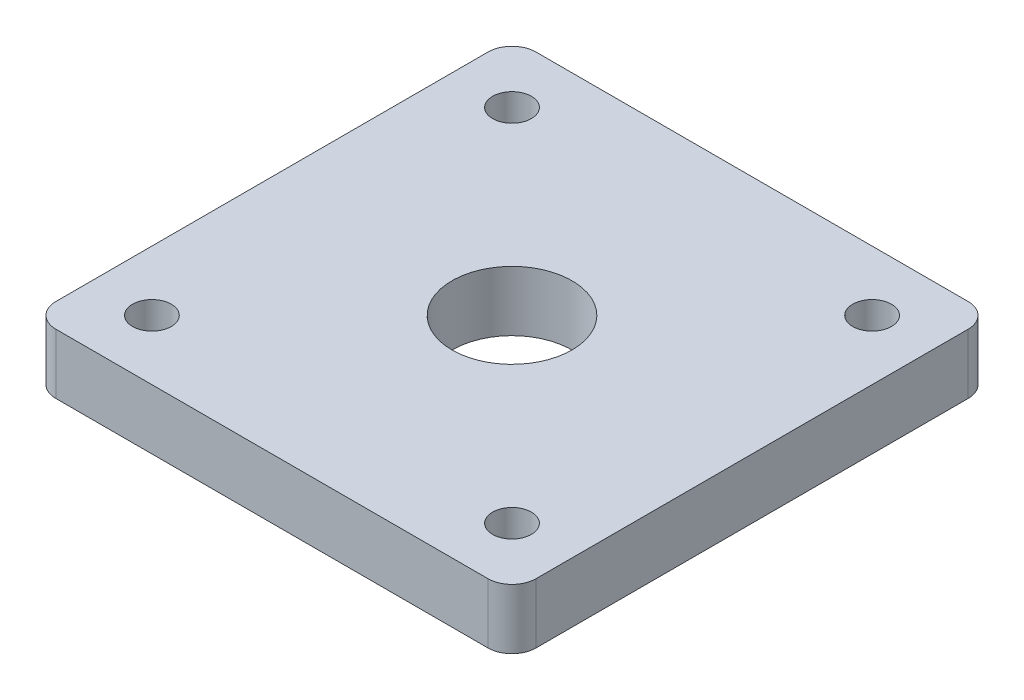
ISO-10303-21;
HEADER;
FILE_DESCRIPTION(('STEP AP214'),'2;1');
FILE_NAME('part.step','',(''),(''),'','','');
FILE_SCHEMA(('AUTOMOTIVE_DESIGN { 1 0 10303 214 1 1 1 1 }'));
ENDSEC;
DATA;
#1=APPLICATION_CONTEXT('core data for automotive mechanical design processes');
#2=APPLICATION_PROTOCOL_DEFINITION('international standard','automotive_design',2000,#1);
#3=PRODUCT_CONTEXT('',#1,'mechanical');
#4=PRODUCT('Part','Part','',(#3));
#5=PRODUCT_RELATED_PRODUCT_CATEGORY('part','',(#4));
#6=PRODUCT_DEFINITION_FORMATION('','',#4);
#7=PRODUCT_DEFINITION_CONTEXT('part definition',#1,'design');
#8=PRODUCT_DEFINITION('design','',#6,#7);
#9=PRODUCT_DEFINITION_SHAPE('','',#8);
#10=(LENGTH_UNIT() NAMED_UNIT(*) SI_UNIT(.MILLI.,.METRE.));
#11=(NAMED_UNIT(*) PLANE_ANGLE_UNIT() SI_UNIT($,.RADIAN.));
#12=(NAMED_UNIT(*) SI_UNIT($,.STERADIAN.) SOLID_ANGLE_UNIT());
#13=UNCERTAINTY_MEASURE_WITH_UNIT(LENGTH_MEASURE(1.E-05),#10,'distance_accuracy_value','');
#14=(GEOMETRIC_REPRESENTATION_CONTEXT(3) GLOBAL_UNCERTAINTY_ASSIGNED_CONTEXT((#13)) GLOBAL_UNIT_ASSIGNED_CONTEXT((#10,
#11,#12)) REPRESENTATION_CONTEXT('',''));
#15=CARTESIAN_POINT('',(0.,0.,0.));
#16=DIRECTION('',(0.,0.,1.));
#17=DIRECTION('',(1.,0.,0.));
#18=AXIS2_PLACEMENT_3D('',#15,#16,#17);
#19=CARTESIAN_POINT('',(-22.86,6.35,-22.86));
#20=DIRECTION('',(0.,-1.,0.));
#21=DIRECTION('',(0.,0.,-1.));
#22=AXIS2_PLACEMENT_3D('',#19,#20,#21);
#23=CYLINDRICAL_SURFACE('',#22,2.54);
#24=CARTESIAN_POINT('',(-22.86,0.,-22.86));
#25=DIRECTION('',(0.,1.,0.));
#26=DIRECTION('',(0.,0.,1.));
#27=AXIS2_PLACEMENT_3D('',#24,#25,#26);
#28=CIRCLE('',#27,2.54);
#29=CARTESIAN_POINT('',(-25.4,0.,-22.86));
#30=VERTEX_POINT('',#29);
#31=CARTESIAN_POINT('',(-22.86,0.,-25.4));
#32=VERTEX_POINT('',#31);
#33=EDGE_CURVE('E164',#30,#32,#28,.F.);
#34=ORIENTED_EDGE('',*,*,#33,.F.);
#35=DIRECTION('',(0.,-1.,0.));
#36=VECTOR('',#35,1.);
#37=CARTESIAN_POINT('',(-25.4,6.35,-22.86));
#38=LINE('',#37,#36);
#39=CARTESIAN_POINT('',(-25.4,6.35,-22.86));
#40=VERTEX_POINT('',#39);
#41=EDGE_CURVE('E11',#40,#30,#38,.T.);
#42=ORIENTED_EDGE('',*,*,#41,.F.);
#43=CARTESIAN_POINT('',(-22.86,6.35,-22.86));
#44=DIRECTION('',(0.,1.,0.));
#45=DIRECTION('',(0.,0.,1.));
#46=AXIS2_PLACEMENT_3D('',#43,#44,#45);
#47=CIRCLE('',#46,2.54);
#48=CARTESIAN_POINT('',(-22.86,6.35,-25.4));
#49=VERTEX_POINT('',#48);
#50=EDGE_CURVE('E210',#40,#49,#47,.F.);
#51=ORIENTED_EDGE('',*,*,#50,.T.);
#52=DIRECTION('',(0.,-1.,0.));
#53=VECTOR('',#52,1.);
#54=CARTESIAN_POINT('',(-22.86,6.35,-25.4));
#55=LINE('',#54,#53);
#56=EDGE_CURVE('E62',#49,#32,#55,.T.);
#57=ORIENTED_EDGE('',*,*,#56,.T.);
#58=EDGE_LOOP('',(#34,#42,#51,#57));
#59=FACE_BOUND('',#58,.T.);
#60=ADVANCED_FACE('F45',(#59),#23,.T.);
#61=CARTESIAN_POINT('',(-25.4,6.35,0.));
#62=DIRECTION('',(-1.,0.,0.));
#63=DIRECTION('',(0.,0.,1.));
#64=AXIS2_PLACEMENT_3D('',#61,#62,#63);
#65=PLANE('',#64);
#66=DIRECTION('',(0.,0.,-1.));
#67=VECTOR('',#66,1.);
#68=CARTESIAN_POINT('',(-25.4,0.,0.));
#69=LINE('',#68,#67);
#70=CARTESIAN_POINT('',(-25.4,0.,22.86));
#71=VERTEX_POINT('',#70);
#72=EDGE_CURVE('E167',#71,#30,#69,.T.);
#73=ORIENTED_EDGE('',*,*,#72,.F.);
#74=DIRECTION('',(0.,-1.,0.));
#75=VECTOR('',#74,1.);
#76=CARTESIAN_POINT('',(-25.4,6.35,22.86));
#77=LINE('',#76,#75);
#78=CARTESIAN_POINT('',(-25.4,6.35,22.86));
#79=VERTEX_POINT('',#78);
#80=EDGE_CURVE('E54',#79,#71,#77,.T.);
#81=ORIENTED_EDGE('',*,*,#80,.F.);
#82=DIRECTION('',(0.,0.,-1.));
#83=VECTOR('',#82,1.);
#84=CARTESIAN_POINT('',(-25.4,6.35,0.));
#85=LINE('',#84,#83);
#86=EDGE_CURVE('E253',#79,#40,#85,.T.);
#87=ORIENTED_EDGE('',*,*,#86,.T.);
#88=ORIENTED_EDGE('',*,*,#41,.T.);
#89=EDGE_LOOP('',(#73,#81,#87,#88));
#90=FACE_BOUND('',#89,.T.);
#91=ADVANCED_FACE('F234',(#90),#65,.T.);
#92=CARTESIAN_POINT('',(-22.86,6.35,22.86));
#93=DIRECTION('',(0.,-1.,0.));
#94=DIRECTION('',(0.,0.,-1.));
#95=AXIS2_PLACEMENT_3D('',#92,#93,#94);
#96=CYLINDRICAL_SURFACE('',#95,2.54);
#97=CARTESIAN_POINT('',(-22.86,0.,22.86));
#98=DIRECTION('',(0.,1.,0.));
#99=DIRECTION('',(0.,0.,1.));
#100=AXIS2_PLACEMENT_3D('',#97,#98,#99);
#101=CIRCLE('',#100,2.54);
#102=CARTESIAN_POINT('',(-22.86,0.,25.4));
#103=VERTEX_POINT('',#102);
#104=EDGE_CURVE('E171',#103,#71,#101,.F.);
#105=ORIENTED_EDGE('',*,*,#104,.F.);
#106=DIRECTION('',(0.,-1.,0.));
#107=VECTOR('',#106,1.);
#108=CARTESIAN_POINT('',(-22.86,6.35,25.4));
#109=LINE('',#108,#107);
#110=CARTESIAN_POINT('',(-22.86,6.35,25.4));
#111=VERTEX_POINT('',#110);
#112=EDGE_CURVE('E221',#111,#103,#109,.T.);
#113=ORIENTED_EDGE('',*,*,#112,.F.);
#114=CARTESIAN_POINT('',(-22.86,6.35,22.86));
#115=DIRECTION('',(0.,1.,0.));
#116=DIRECTION('',(0.,0.,1.));
#117=AXIS2_PLACEMENT_3D('',#114,#115,#116);
#118=CIRCLE('',#117,2.54);
#119=EDGE_CURVE('E230',#111,#79,#118,.F.);
#120=ORIENTED_EDGE('',*,*,#119,.T.);
#121=ORIENTED_EDGE('',*,*,#80,.T.);
#122=EDGE_LOOP('',(#105,#113,#120,#121));
#123=FACE_BOUND('',#122,.T.);
#124=ADVANCED_FACE('F228',(#123),#96,.T.);
#125=CARTESIAN_POINT('',(0.,6.35,25.4));
#126=DIRECTION('',(0.,0.,-1.));
#127=DIRECTION('',(-1.,0.,0.));
#128=AXIS2_PLACEMENT_3D('',#125,#126,#127);
#129=PLANE('',#128);
#130=DIRECTION('',(1.,0.,0.));
#131=VECTOR('',#130,1.);
#132=CARTESIAN_POINT('',(0.,0.,25.4));
#133=LINE('',#132,#131);
#134=CARTESIAN_POINT('',(22.86,0.,25.4));
#135=VERTEX_POINT('',#134);
#136=EDGE_CURVE('E175',#103,#135,#133,.T.);
#137=ORIENTED_EDGE('',*,*,#136,.T.);
#138=DIRECTION('',(0.,-1.,0.));
#139=VECTOR('',#138,1.);
#140=CARTESIAN_POINT('',(22.86,6.35,25.4));
#141=LINE('',#140,#139);
#142=CARTESIAN_POINT('',(22.86,6.35,25.4));
#143=VERTEX_POINT('',#142);
#144=EDGE_CURVE('E217',#143,#135,#141,.T.);
#145=ORIENTED_EDGE('',*,*,#144,.F.);
#146=DIRECTION('',(1.,0.,0.));
#147=VECTOR('',#146,1.);
#148=CARTESIAN_POINT('',(0.,6.35,25.4));
#149=LINE('',#148,#147);
#150=EDGE_CURVE('E247',#111,#143,#149,.T.);
#151=ORIENTED_EDGE('',*,*,#150,.F.);
#152=ORIENTED_EDGE('',*,*,#112,.T.);
#153=EDGE_LOOP('',(#137,#145,#151,#152));
#154=FACE_BOUND('',#153,.T.);
#155=ADVANCED_FACE('F242',(#154),#129,.F.);
#156=CARTESIAN_POINT('',(22.86,6.35,22.86));
#157=DIRECTION('',(0.,-1.,0.));
#158=DIRECTION('',(0.,0.,-1.));
#159=AXIS2_PLACEMENT_3D('',#156,#157,#158);
#160=CYLINDRICAL_SURFACE('',#159,2.54);
#161=CARTESIAN_POINT('',(22.86,0.,22.86));
#162=DIRECTION('',(0.,1.,0.));
#163=DIRECTION('',(0.,0.,1.));
#164=AXIS2_PLACEMENT_3D('',#161,#162,#163);
#165=CIRCLE('',#164,2.54);
#166=CARTESIAN_POINT('',(25.4,0.,22.86));
#167=VERTEX_POINT('',#166);
#168=EDGE_CURVE('E178',#135,#167,#165,.T.);
#169=ORIENTED_EDGE('',*,*,#168,.T.);
#170=DIRECTION('',(0.,-1.,0.));
#171=VECTOR('',#170,1.);
#172=CARTESIAN_POINT('',(25.4,6.35,22.86));
#173=LINE('',#172,#171);
#174=CARTESIAN_POINT('',(25.4,6.35,22.86));
#175=VERTEX_POINT('',#174);
#176=EDGE_CURVE('E134',#175,#167,#173,.T.);
#177=ORIENTED_EDGE('',*,*,#176,.F.);
#178=CARTESIAN_POINT('',(22.86,6.35,22.86));
#179=DIRECTION('',(0.,1.,0.));
#180=DIRECTION('',(0.,0.,1.));
#181=AXIS2_PLACEMENT_3D('',#178,#179,#180);
#182=CIRCLE('',#181,2.54);
#183=EDGE_CURVE('E120',#143,#175,#182,.T.);
#184=ORIENTED_EDGE('',*,*,#183,.F.);
#185=ORIENTED_EDGE('',*,*,#144,.T.);
#186=EDGE_LOOP('',(#169,#177,#184,#185));
#187=FACE_BOUND('',#186,.T.);
#188=ADVANCED_FACE('F245',(#187),#160,.T.);
#189=CARTESIAN_POINT('',(25.4,6.35,0.));
#190=DIRECTION('',(-1.,0.,0.));
#191=DIRECTION('',(0.,0.,1.));
#192=AXIS2_PLACEMENT_3D('',#189,#190,#191);
#193=PLANE('',#192);
#194=DIRECTION('',(0.,0.,-1.));
#195=VECTOR('',#194,1.);
#196=CARTESIAN_POINT('',(25.4,0.,0.));
#197=LINE('',#196,#195);
#198=CARTESIAN_POINT('',(25.4,0.,-22.86));
#199=VERTEX_POINT('',#198);
#200=EDGE_CURVE('E130',#167,#199,#197,.T.);
#201=ORIENTED_EDGE('',*,*,#200,.T.);
#202=DIRECTION('',(0.,-1.,0.));
#203=VECTOR('',#202,1.);
#204=CARTESIAN_POINT('',(25.4,6.35,-22.86));
#205=LINE('',#204,#203);
#206=CARTESIAN_POINT('',(25.4,6.35,-22.86));
#207=VERTEX_POINT('',#206);
#208=EDGE_CURVE('E127',#207,#199,#205,.T.);
#209=ORIENTED_EDGE('',*,*,#208,.F.);
#210=DIRECTION('',(0.,0.,-1.));
#211=VECTOR('',#210,1.);
#212=CARTESIAN_POINT('',(25.4,6.35,0.));
#213=LINE('',#212,#211);
#214=EDGE_CURVE('E112',#175,#207,#213,.T.);
#215=ORIENTED_EDGE('',*,*,#214,.F.);
#216=ORIENTED_EDGE('',*,*,#176,.T.);
#217=EDGE_LOOP('',(#201,#209,#215,#216));
#218=FACE_BOUND('',#217,.T.);
#219=ADVANCED_FACE('F128',(#218),#193,.F.);
#220=CARTESIAN_POINT('',(22.86,6.35,-22.86));
#221=DIRECTION('',(0.,-1.,0.));
#222=DIRECTION('',(0.,0.,-1.));
#223=AXIS2_PLACEMENT_3D('',#220,#221,#222);
#224=CYLINDRICAL_SURFACE('',#223,2.54);
#225=CARTESIAN_POINT('',(22.86,0.,-22.86));
#226=DIRECTION('',(0.,1.,0.));
#227=DIRECTION('',(0.,0.,1.));
#228=AXIS2_PLACEMENT_3D('',#225,#226,#227);
#229=CIRCLE('',#228,2.54);
#230=CARTESIAN_POINT('',(22.86,0.,-25.4));
#231=VERTEX_POINT('',#230);
#232=EDGE_CURVE('E183',#231,#199,#229,.F.);
#233=ORIENTED_EDGE('',*,*,#232,.F.);
#234=DIRECTION('',(0.,-1.,0.));
#235=VECTOR('',#234,1.);
#236=CARTESIAN_POINT('',(22.86,6.35,-25.4));
#237=LINE('',#236,#235);
#238=CARTESIAN_POINT('',(22.86,6.35,-25.4));
#239=VERTEX_POINT('',#238);
#240=EDGE_CURVE('E87',#239,#231,#237,.T.);
#241=ORIENTED_EDGE('',*,*,#240,.F.);
#242=CARTESIAN_POINT('',(22.86,6.35,-22.86));
#243=DIRECTION('',(0.,1.,0.));
#244=DIRECTION('',(0.,0.,1.));
#245=AXIS2_PLACEMENT_3D('',#242,#243,#244);
#246=CIRCLE('',#245,2.54);
#247=EDGE_CURVE('E118',#239,#207,#246,.F.);
#248=ORIENTED_EDGE('',*,*,#247,.T.);
#249=ORIENTED_EDGE('',*,*,#208,.T.);
#250=EDGE_LOOP('',(#233,#241,#248,#249));
#251=FACE_BOUND('',#250,.T.);
#252=ADVANCED_FACE('F136',(#251),#224,.T.);
#253=CARTESIAN_POINT('',(0.,6.35,0.));
#254=DIRECTION('',(0.,-1.,0.));
#255=DIRECTION('',(0.,0.,-1.));
#256=AXIS2_PLACEMENT_3D('',#253,#254,#255);
#257=CYLINDRICAL_SURFACE('',#256,6.35);
#258=CARTESIAN_POINT('',(0.,6.35,0.));
#259=DIRECTION('',(0.,1.,0.));
#260=DIRECTION('',(0.,0.,1.));
#261=AXIS2_PLACEMENT_3D('',#258,#259,#260);
#262=CIRCLE('',#261,6.35);
#263=CARTESIAN_POINT('',(0.,6.35,6.35000000000001));
#264=VERTEX_POINT('',#263);
#265=EDGE_CURVE('E156',#264,#264,#262,.T.);
#266=ORIENTED_EDGE('',*,*,#265,.T.);
#267=EDGE_LOOP('',(#266));
#268=FACE_BOUND('',#267,.T.);
#269=CARTESIAN_POINT('',(0.,0.,0.));
#270=DIRECTION('',(0.,1.,0.));
#271=DIRECTION('',(0.,0.,1.));
#272=AXIS2_PLACEMENT_3D('',#269,#270,#271);
#273=CIRCLE('',#272,6.35);
#274=CARTESIAN_POINT('',(0.,0.,6.35000000000001));
#275=VERTEX_POINT('',#274);
#276=EDGE_CURVE('E202',#275,#275,#273,.T.);
#277=ORIENTED_EDGE('',*,*,#276,.F.);
#278=EDGE_LOOP('',(#277));
#279=FACE_BOUND('',#278,.T.);
#280=ADVANCED_FACE('F287',(#268,#279),#257,.F.);
#281=CARTESIAN_POINT('',(19.05,6.35,-19.05));
#282=DIRECTION('',(0.,-1.,0.));
#283=DIRECTION('',(0.,0.,-1.));
#284=AXIS2_PLACEMENT_3D('',#281,#282,#283);
#285=CYLINDRICAL_SURFACE('',#284,2.05);
#286=CARTESIAN_POINT('',(19.05,6.35,-19.05));
#287=DIRECTION('',(0.,1.,0.));
#288=DIRECTION('',(0.,0.,1.));
#289=AXIS2_PLACEMENT_3D('',#286,#287,#288);
#290=CIRCLE('',#289,2.05);
#291=CARTESIAN_POINT('',(19.05,6.35,-17.));
#292=VERTEX_POINT('',#291);
#293=EDGE_CURVE('E152',#292,#292,#290,.T.);
#294=ORIENTED_EDGE('',*,*,#293,.T.);
#295=EDGE_LOOP('',(#294));
#296=FACE_BOUND('',#295,.T.);
#297=CARTESIAN_POINT('',(19.05,0.,-19.05));
#298=DIRECTION('',(0.,1.,0.));
#299=DIRECTION('',(0.,0.,1.));
#300=AXIS2_PLACEMENT_3D('',#297,#298,#299);
#301=CIRCLE('',#300,2.05);
#302=CARTESIAN_POINT('',(19.05,0.,-17.));
#303=VERTEX_POINT('',#302);
#304=EDGE_CURVE('E198',#303,#303,#301,.T.);
#305=ORIENTED_EDGE('',*,*,#304,.F.);
#306=EDGE_LOOP('',(#305));
#307=FACE_BOUND('',#306,.T.);
#308=ADVANCED_FACE('F291',(#296,#307),#285,.F.);
#309=CARTESIAN_POINT('',(19.05,6.35,19.05));
#310=DIRECTION('',(0.,-1.,0.));
#311=DIRECTION('',(0.,0.,-1.));
#312=AXIS2_PLACEMENT_3D('',#309,#310,#311);
#313=CYLINDRICAL_SURFACE('',#312,2.05);
#314=CARTESIAN_POINT('',(19.05,6.35,19.05));
#315=DIRECTION('',(0.,1.,0.));
#316=DIRECTION('',(0.,0.,1.));
#317=AXIS2_PLACEMENT_3D('',#314,#315,#316);
#318=CIRCLE('',#317,2.05);
#319=CARTESIAN_POINT('',(19.05,6.35,21.1));
#320=VERTEX_POINT('',#319);
#321=EDGE_CURVE('E148',#320,#320,#318,.T.);
#322=ORIENTED_EDGE('',*,*,#321,.T.);
#323=EDGE_LOOP('',(#322));
#324=FACE_BOUND('',#323,.T.);
#325=CARTESIAN_POINT('',(19.05,0.,19.05));
#326=DIRECTION('',(0.,1.,0.));
#327=DIRECTION('',(0.,0.,1.));
#328=AXIS2_PLACEMENT_3D('',#325,#326,#327);
#329=CIRCLE('',#328,2.05);
#330=CARTESIAN_POINT('',(19.05,0.,21.1));
#331=VERTEX_POINT('',#330);
#332=EDGE_CURVE('E194',#331,#331,#329,.T.);
#333=ORIENTED_EDGE('',*,*,#332,.F.);
#334=EDGE_LOOP('',(#333));
#335=FACE_BOUND('',#334,.T.);
#336=ADVANCED_FACE('F268',(#324,#335),#313,.F.);
#337=CARTESIAN_POINT('',(-19.05,6.35,19.05));
#338=DIRECTION('',(0.,-1.,0.));
#339=DIRECTION('',(0.,0.,-1.));
#340=AXIS2_PLACEMENT_3D('',#337,#338,#339);
#341=CYLINDRICAL_SURFACE('',#340,2.05);
#342=CARTESIAN_POINT('',(-19.05,6.35,19.05));
#343=DIRECTION('',(0.,1.,0.));
#344=DIRECTION('',(0.,0.,1.));
#345=AXIS2_PLACEMENT_3D('',#342,#343,#344);
#346=CIRCLE('',#345,2.05);
#347=CARTESIAN_POINT('',(-19.05,6.35,21.1));
#348=VERTEX_POINT('',#347);
#349=EDGE_CURVE('E141',#348,#348,#346,.T.);
#350=ORIENTED_EDGE('',*,*,#349,.T.);
#351=EDGE_LOOP('',(#350));
#352=FACE_BOUND('',#351,.T.);
#353=CARTESIAN_POINT('',(-19.05,0.,19.05));
#354=DIRECTION('',(0.,1.,0.));
#355=DIRECTION('',(0.,0.,1.));
#356=AXIS2_PLACEMENT_3D('',#353,#354,#355);
#357=CIRCLE('',#356,2.05);
#358=CARTESIAN_POINT('',(-19.05,0.,21.1));
#359=VERTEX_POINT('',#358);
#360=EDGE_CURVE('E190',#359,#359,#357,.T.);
#361=ORIENTED_EDGE('',*,*,#360,.F.);
#362=EDGE_LOOP('',(#361));
#363=FACE_BOUND('',#362,.T.);
#364=ADVANCED_FACE('F260',(#352,#363),#341,.F.);
#365=CARTESIAN_POINT('',(0.,6.35,-25.4));
#366=DIRECTION('',(0.,0.,-1.));
#367=DIRECTION('',(-1.,0.,0.));
#368=AXIS2_PLACEMENT_3D('',#365,#366,#367);
#369=PLANE('',#368);
#370=DIRECTION('',(1.,0.,0.));
#371=VECTOR('',#370,1.);
#372=CARTESIAN_POINT('',(0.,0.,-25.4));
#373=LINE('',#372,#371);
#374=EDGE_CURVE('E186',#32,#231,#373,.T.);
#375=ORIENTED_EDGE('',*,*,#374,.F.);
#376=ORIENTED_EDGE('',*,*,#56,.F.);
#377=DIRECTION('',(1.,0.,0.));
#378=VECTOR('',#377,1.);
#379=CARTESIAN_POINT('',(0.,6.35,-25.4));
#380=LINE('',#379,#378);
#381=EDGE_CURVE('E138',#49,#239,#380,.T.);
#382=ORIENTED_EDGE('',*,*,#381,.T.);
#383=ORIENTED_EDGE('',*,*,#240,.T.);
#384=EDGE_LOOP('',(#375,#376,#382,#383));
#385=FACE_BOUND('',#384,.T.);
#386=ADVANCED_FACE('F257',(#385),#369,.T.);
#387=CARTESIAN_POINT('',(-19.05,6.35,-19.05));
#388=DIRECTION('',(0.,-1.,0.));
#389=DIRECTION('',(0.,0.,-1.));
#390=AXIS2_PLACEMENT_3D('',#387,#388,#389);
#391=CYLINDRICAL_SURFACE('',#390,2.05);
#392=CARTESIAN_POINT('',(-19.05,6.35,-19.05));
#393=DIRECTION('',(0.,1.,0.));
#394=DIRECTION('',(0.,0.,1.));
#395=AXIS2_PLACEMENT_3D('',#392,#393,#394);
#396=CIRCLE('',#395,2.05);
#397=CARTESIAN_POINT('',(-19.05,6.35,-17.));
#398=VERTEX_POINT('',#397);
#399=EDGE_CURVE('E160',#398,#398,#396,.T.);
#400=ORIENTED_EDGE('',*,*,#399,.T.);
#401=EDGE_LOOP('',(#400));
#402=FACE_BOUND('',#401,.T.);
#403=CARTESIAN_POINT('',(-19.05,0.,-19.05));
#404=DIRECTION('',(0.,1.,0.));
#405=DIRECTION('',(0.,0.,1.));
#406=AXIS2_PLACEMENT_3D('',#403,#404,#405);
#407=CIRCLE('',#406,2.05);
#408=CARTESIAN_POINT('',(-19.05,0.,-17.));
#409=VERTEX_POINT('',#408);
#410=EDGE_CURVE('E206',#409,#409,#407,.T.);
#411=ORIENTED_EDGE('',*,*,#410,.F.);
#412=EDGE_LOOP('',(#411));
#413=FACE_BOUND('',#412,.T.);
#414=ADVANCED_FACE('F259',(#402,#413),#391,.F.);
#415=CARTESIAN_POINT('',(0.,6.35,0.));
#416=DIRECTION('',(0.,1.,0.));
#417=DIRECTION('',(0.,0.,1.));
#418=AXIS2_PLACEMENT_3D('',#415,#416,#417);
#419=PLANE('',#418);
#420=ORIENTED_EDGE('',*,*,#50,.F.);
#421=ORIENTED_EDGE('',*,*,#86,.F.);
#422=ORIENTED_EDGE('',*,*,#119,.F.);
#423=ORIENTED_EDGE('',*,*,#150,.T.);
#424=ORIENTED_EDGE('',*,*,#183,.T.);
#425=ORIENTED_EDGE('',*,*,#214,.T.);
#426=ORIENTED_EDGE('',*,*,#247,.F.);
#427=ORIENTED_EDGE('',*,*,#381,.F.);
#428=EDGE_LOOP('',(#420,#421,#422,#423,#424,#425,#426,#427));
#429=FACE_BOUND('',#428,.T.);
#430=ORIENTED_EDGE('',*,*,#349,.F.);
#431=EDGE_LOOP('',(#430));
#432=FACE_BOUND('',#431,.T.);
#433=ORIENTED_EDGE('',*,*,#321,.F.);
#434=EDGE_LOOP('',(#433));
#435=FACE_BOUND('',#434,.T.);
#436=ORIENTED_EDGE('',*,*,#293,.F.);
#437=EDGE_LOOP('',(#436));
#438=FACE_BOUND('',#437,.T.);
#439=ORIENTED_EDGE('',*,*,#265,.F.);
#440=EDGE_LOOP('',(#439));
#441=FACE_BOUND('',#440,.T.);
#442=ORIENTED_EDGE('',*,*,#399,.F.);
#443=EDGE_LOOP('',(#442));
#444=FACE_BOUND('',#443,.T.);
#445=ADVANCED_FACE('F114',(#429,#432,#435,#438,#441,#444),#419,.T.);
#446=CARTESIAN_POINT('',(0.,0.,0.));
#447=DIRECTION('',(0.,1.,0.));
#448=DIRECTION('',(0.,0.,1.));
#449=AXIS2_PLACEMENT_3D('',#446,#447,#448);
#450=PLANE('',#449);
#451=ORIENTED_EDGE('',*,*,#33,.T.);
#452=ORIENTED_EDGE('',*,*,#374,.T.);
#453=ORIENTED_EDGE('',*,*,#232,.T.);
#454=ORIENTED_EDGE('',*,*,#200,.F.);
#455=ORIENTED_EDGE('',*,*,#168,.F.);
#456=ORIENTED_EDGE('',*,*,#136,.F.);
#457=ORIENTED_EDGE('',*,*,#104,.T.);
#458=ORIENTED_EDGE('',*,*,#72,.T.);
#459=EDGE_LOOP('',(#451,#452,#453,#454,#455,#456,#457,#458));
#460=FACE_BOUND('',#459,.T.);
#461=ORIENTED_EDGE('',*,*,#360,.T.);
#462=EDGE_LOOP('',(#461));
#463=FACE_BOUND('',#462,.T.);
#464=ORIENTED_EDGE('',*,*,#332,.T.);
#465=EDGE_LOOP('',(#464));
#466=FACE_BOUND('',#465,.T.);
#467=ORIENTED_EDGE('',*,*,#304,.T.);
#468=EDGE_LOOP('',(#467));
#469=FACE_BOUND('',#468,.T.);
#470=ORIENTED_EDGE('',*,*,#276,.T.);
#471=EDGE_LOOP('',(#470));
#472=FACE_BOUND('',#471,.T.);
#473=ORIENTED_EDGE('',*,*,#410,.T.);
#474=EDGE_LOOP('',(#473));
#475=FACE_BOUND('',#474,.T.);
#476=ADVANCED_FACE('F237',(#460,#463,#466,#469,#472,#475),#450,.F.);
#477=CLOSED_SHELL('',(#60,#91,#124,#155,#188,#219,#252,#280,#308,#336,#364,#386,#414,#445,#476));
#478=MANIFOLD_SOLID_BREP('B2',#477);
#479=ADVANCED_BREP_SHAPE_REPRESENTATION('',(#18,#478),#14);
#480=SHAPE_DEFINITION_REPRESENTATION(#9,#479);
ENDSEC;
END-ISO-10303-21;
